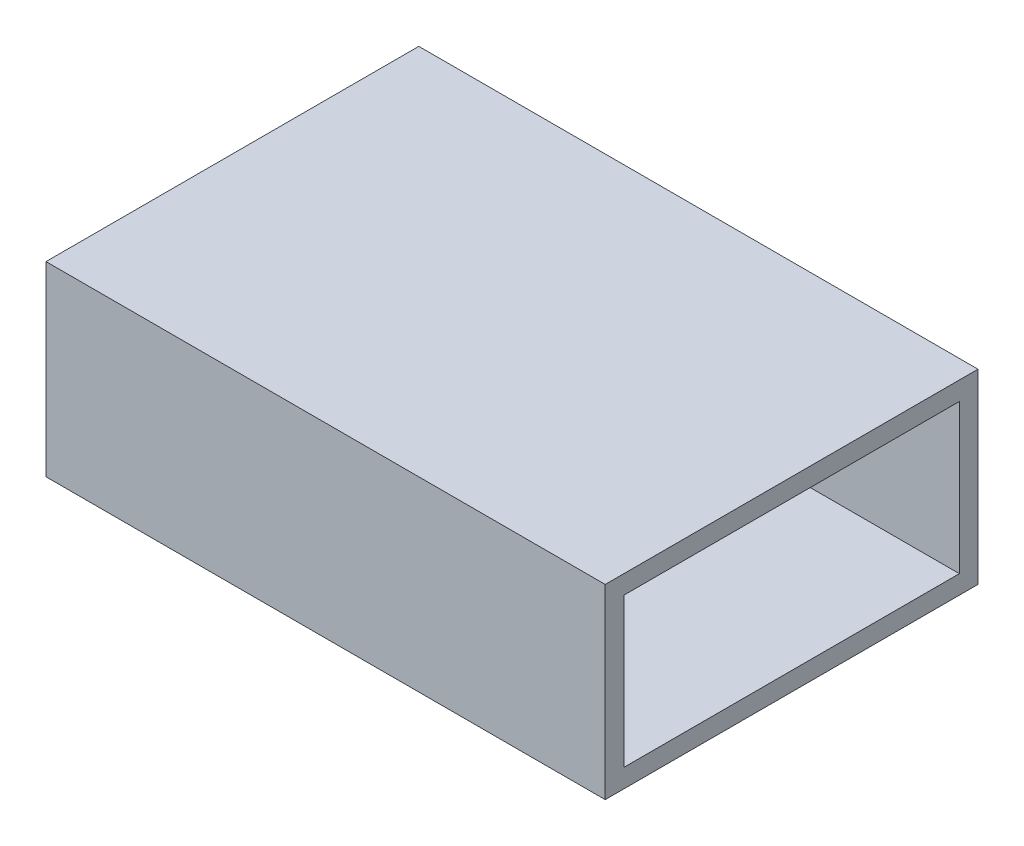
ISO-10303-21;
HEADER;
FILE_DESCRIPTION(('STEP AP214'),'2;1');
FILE_NAME('part.step','',(''),(''),'','','');
FILE_SCHEMA(('AUTOMOTIVE_DESIGN { 1 0 10303 214 1 1 1 1 }'));
ENDSEC;
DATA;
#1=APPLICATION_CONTEXT('core data for automotive mechanical design processes');
#2=APPLICATION_PROTOCOL_DEFINITION('international standard','automotive_design',2000,#1);
#3=PRODUCT_CONTEXT('',#1,'mechanical');
#4=PRODUCT('Part','Part','',(#3));
#5=PRODUCT_RELATED_PRODUCT_CATEGORY('part','',(#4));
#6=PRODUCT_DEFINITION_FORMATION('','',#4);
#7=PRODUCT_DEFINITION_CONTEXT('part definition',#1,'design');
#8=PRODUCT_DEFINITION('design','',#6,#7);
#9=PRODUCT_DEFINITION_SHAPE('','',#8);
#10=(LENGTH_UNIT() NAMED_UNIT(*) SI_UNIT(.MILLI.,.METRE.));
#11=(NAMED_UNIT(*) PLANE_ANGLE_UNIT() SI_UNIT($,.RADIAN.));
#12=(NAMED_UNIT(*) SI_UNIT($,.STERADIAN.) SOLID_ANGLE_UNIT());
#13=UNCERTAINTY_MEASURE_WITH_UNIT(LENGTH_MEASURE(1.E-05),#10,'distance_accuracy_value','');
#14=(GEOMETRIC_REPRESENTATION_CONTEXT(3) GLOBAL_UNCERTAINTY_ASSIGNED_CONTEXT((#13)) GLOBAL_UNIT_ASSIGNED_CONTEXT((#10,
#11,#12)) REPRESENTATION_CONTEXT('',''));
#15=CARTESIAN_POINT('',(0.,0.,0.));
#16=DIRECTION('',(0.,0.,1.));
#17=DIRECTION('',(1.,0.,0.));
#18=AXIS2_PLACEMENT_3D('',#15,#16,#17);
#19=CARTESIAN_POINT('',(38.1,12.6999999999999,25.4));
#20=DIRECTION('',(0.,-1.,0.));
#21=DIRECTION('',(0.,0.,-1.));
#22=AXIS2_PLACEMENT_3D('',#19,#20,#21);
#23=PLANE('',#22);
#24=DIRECTION('',(0.,0.,1.));
#25=VECTOR('',#24,1.);
#26=CARTESIAN_POINT('',(-38.1,12.6999999999999,25.4));
#27=LINE('',#26,#25);
#28=CARTESIAN_POINT('',(-38.1,12.7000000000001,-25.4));
#29=VERTEX_POINT('',#28);
#30=CARTESIAN_POINT('',(-38.1,12.6999999999999,25.4));
#31=VERTEX_POINT('',#30);
#32=EDGE_CURVE('E171',#29,#31,#27,.T.);
#33=ORIENTED_EDGE('',*,*,#32,.T.);
#34=DIRECTION('',(-1.,0.,0.));
#35=VECTOR('',#34,1.);
#36=CARTESIAN_POINT('',(38.1,12.6999999999999,25.4));
#37=LINE('',#36,#35);
#38=CARTESIAN_POINT('',(38.1,12.6999999999999,25.4));
#39=VERTEX_POINT('',#38);
#40=EDGE_CURVE('E12',#39,#31,#37,.T.);
#41=ORIENTED_EDGE('',*,*,#40,.F.);
#42=DIRECTION('',(0.,0.,1.));
#43=VECTOR('',#42,1.);
#44=CARTESIAN_POINT('',(38.1,12.6999999999999,25.4));
#45=LINE('',#44,#43);
#46=CARTESIAN_POINT('',(38.1,12.7000000000001,-25.4));
#47=VERTEX_POINT('',#46);
#48=EDGE_CURVE('E137',#47,#39,#45,.T.);
#49=ORIENTED_EDGE('',*,*,#48,.F.);
#50=DIRECTION('',(-1.,0.,0.));
#51=VECTOR('',#50,1.);
#52=CARTESIAN_POINT('',(38.1,12.7000000000001,-25.4));
#53=LINE('',#52,#51);
#54=EDGE_CURVE('E182',#47,#29,#53,.T.);
#55=ORIENTED_EDGE('',*,*,#54,.T.);
#56=EDGE_LOOP('',(#33,#41,#49,#55));
#57=FACE_BOUND('',#56,.T.);
#58=ADVANCED_FACE('F55',(#57),#23,.F.);
#59=CARTESIAN_POINT('',(38.1,-12.7000000000001,25.3999999999999));
#60=DIRECTION('',(0.,0.,-1.));
#61=DIRECTION('',(0.,1.,0.));
#62=AXIS2_PLACEMENT_3D('',#59,#60,#61);
#63=PLANE('',#62);
#64=DIRECTION('',(0.,-1.,0.));
#65=VECTOR('',#64,1.);
#66=CARTESIAN_POINT('',(-38.1,-12.7000000000001,25.3999999999999));
#67=LINE('',#66,#65);
#68=CARTESIAN_POINT('',(-38.1,-12.7000000000001,25.3999999999999));
#69=VERTEX_POINT('',#68);
#70=EDGE_CURVE('E143',#31,#69,#67,.T.);
#71=ORIENTED_EDGE('',*,*,#70,.T.);
#72=DIRECTION('',(-1.,0.,0.));
#73=VECTOR('',#72,1.);
#74=CARTESIAN_POINT('',(38.1,-12.7000000000001,25.3999999999999));
#75=LINE('',#74,#73);
#76=CARTESIAN_POINT('',(38.1,-12.7000000000001,25.3999999999999));
#77=VERTEX_POINT('',#76);
#78=EDGE_CURVE('E66',#77,#69,#75,.T.);
#79=ORIENTED_EDGE('',*,*,#78,.F.);
#80=DIRECTION('',(0.,-1.,0.));
#81=VECTOR('',#80,1.);
#82=CARTESIAN_POINT('',(38.1,-12.7000000000001,25.3999999999999));
#83=LINE('',#82,#81);
#84=EDGE_CURVE('E131',#39,#77,#83,.T.);
#85=ORIENTED_EDGE('',*,*,#84,.F.);
#86=ORIENTED_EDGE('',*,*,#40,.T.);
#87=EDGE_LOOP('',(#71,#79,#85,#86));
#88=FACE_BOUND('',#87,.T.);
#89=ADVANCED_FACE('F142',(#88),#63,.F.);
#90=CARTESIAN_POINT('',(38.1,-12.7000000000001,25.3999999999999));
#91=DIRECTION('',(0.,1.,0.));
#92=DIRECTION('',(0.,0.,1.));
#93=AXIS2_PLACEMENT_3D('',#90,#91,#92);
#94=PLANE('',#93);
#95=DIRECTION('',(0.,0.,-1.));
#96=VECTOR('',#95,1.);
#97=CARTESIAN_POINT('',(-38.1,-12.7000000000001,25.3999999999999));
#98=LINE('',#97,#96);
#99=CARTESIAN_POINT('',(-38.1,-12.6999999999999,-25.4000000000001));
#100=VERTEX_POINT('',#99);
#101=EDGE_CURVE('E104',#69,#100,#98,.T.);
#102=ORIENTED_EDGE('',*,*,#101,.T.);
#103=DIRECTION('',(-1.,0.,0.));
#104=VECTOR('',#103,1.);
#105=CARTESIAN_POINT('',(38.1,-12.6999999999999,-25.4000000000001));
#106=LINE('',#105,#104);
#107=CARTESIAN_POINT('',(38.1,-12.6999999999999,-25.4000000000001));
#108=VERTEX_POINT('',#107);
#109=EDGE_CURVE('E145',#108,#100,#106,.T.);
#110=ORIENTED_EDGE('',*,*,#109,.F.);
#111=DIRECTION('',(0.,0.,-1.));
#112=VECTOR('',#111,1.);
#113=CARTESIAN_POINT('',(38.1,-12.7000000000001,25.3999999999999));
#114=LINE('',#113,#112);
#115=EDGE_CURVE('E135',#77,#108,#114,.T.);
#116=ORIENTED_EDGE('',*,*,#115,.F.);
#117=ORIENTED_EDGE('',*,*,#78,.T.);
#118=EDGE_LOOP('',(#102,#110,#116,#117));
#119=FACE_BOUND('',#118,.T.);
#120=ADVANCED_FACE('F147',(#119),#94,.F.);
#121=CARTESIAN_POINT('',(38.1,-10.1600000000001,22.86));
#122=DIRECTION('',(0.,0.,-1.));
#123=DIRECTION('',(0.,1.,0.));
#124=AXIS2_PLACEMENT_3D('',#121,#122,#123);
#125=PLANE('',#124);
#126=DIRECTION('',(0.,-1.,0.));
#127=VECTOR('',#126,1.);
#128=CARTESIAN_POINT('',(-38.1,-10.1600000000001,22.86));
#129=LINE('',#128,#127);
#130=CARTESIAN_POINT('',(-38.1,10.1599999999999,22.86));
#131=VERTEX_POINT('',#130);
#132=CARTESIAN_POINT('',(-38.1,-10.1600000000001,22.86));
#133=VERTEX_POINT('',#132);
#134=EDGE_CURVE('E155',#131,#133,#129,.T.);
#135=ORIENTED_EDGE('',*,*,#134,.F.);
#136=DIRECTION('',(-1.,0.,0.));
#137=VECTOR('',#136,1.);
#138=CARTESIAN_POINT('',(38.1,10.1599999999999,22.86));
#139=LINE('',#138,#137);
#140=CARTESIAN_POINT('',(38.1,10.1599999999999,22.86));
#141=VERTEX_POINT('',#140);
#142=EDGE_CURVE('E59',#141,#131,#139,.T.);
#143=ORIENTED_EDGE('',*,*,#142,.F.);
#144=DIRECTION('',(0.,-1.,0.));
#145=VECTOR('',#144,1.);
#146=CARTESIAN_POINT('',(38.1,-10.1600000000001,22.86));
#147=LINE('',#146,#145);
#148=CARTESIAN_POINT('',(38.1,-10.1600000000001,22.86));
#149=VERTEX_POINT('',#148);
#150=EDGE_CURVE('E181',#141,#149,#147,.T.);
#151=ORIENTED_EDGE('',*,*,#150,.T.);
#152=DIRECTION('',(-1.,0.,0.));
#153=VECTOR('',#152,1.);
#154=CARTESIAN_POINT('',(38.1,-10.1600000000001,22.86));
#155=LINE('',#154,#153);
#156=EDGE_CURVE('E151',#149,#133,#155,.T.);
#157=ORIENTED_EDGE('',*,*,#156,.T.);
#158=EDGE_LOOP('',(#135,#143,#151,#157));
#159=FACE_BOUND('',#158,.T.);
#160=ADVANCED_FACE('F57',(#159),#125,.T.);
#161=CARTESIAN_POINT('',(38.1,10.1599999999999,22.86));
#162=DIRECTION('',(0.,-1.,0.));
#163=DIRECTION('',(0.,0.,-1.));
#164=AXIS2_PLACEMENT_3D('',#161,#162,#163);
#165=PLANE('',#164);
#166=DIRECTION('',(0.,0.,1.));
#167=VECTOR('',#166,1.);
#168=CARTESIAN_POINT('',(-38.1,10.1599999999999,22.86));
#169=LINE('',#168,#167);
#170=CARTESIAN_POINT('',(-38.1,10.1600000000001,-22.86));
#171=VERTEX_POINT('',#170);
#172=EDGE_CURVE('E159',#171,#131,#169,.T.);
#173=ORIENTED_EDGE('',*,*,#172,.F.);
#174=DIRECTION('',(-1.,0.,0.));
#175=VECTOR('',#174,1.);
#176=CARTESIAN_POINT('',(38.1,10.1600000000001,-22.86));
#177=LINE('',#176,#175);
#178=CARTESIAN_POINT('',(38.1,10.1600000000001,-22.86));
#179=VERTEX_POINT('',#178);
#180=EDGE_CURVE('E191',#179,#171,#177,.T.);
#181=ORIENTED_EDGE('',*,*,#180,.F.);
#182=DIRECTION('',(0.,0.,1.));
#183=VECTOR('',#182,1.);
#184=CARTESIAN_POINT('',(38.1,10.1599999999999,22.86));
#185=LINE('',#184,#183);
#186=EDGE_CURVE('E202',#179,#141,#185,.T.);
#187=ORIENTED_EDGE('',*,*,#186,.T.);
#188=ORIENTED_EDGE('',*,*,#142,.T.);
#189=EDGE_LOOP('',(#173,#181,#187,#188));
#190=FACE_BOUND('',#189,.T.);
#191=ADVANCED_FACE('F200',(#190),#165,.T.);
#192=CARTESIAN_POINT('',(38.1,-10.1599999999999,-22.86));
#193=DIRECTION('',(0.,0.,1.));
#194=DIRECTION('',(0.,-1.,0.));
#195=AXIS2_PLACEMENT_3D('',#192,#193,#194);
#196=PLANE('',#195);
#197=DIRECTION('',(0.,1.,0.));
#198=VECTOR('',#197,1.);
#199=CARTESIAN_POINT('',(-38.1,-10.1599999999999,-22.86));
#200=LINE('',#199,#198);
#201=CARTESIAN_POINT('',(-38.1,-10.1599999999999,-22.86));
#202=VERTEX_POINT('',#201);
#203=EDGE_CURVE('E163',#202,#171,#200,.T.);
#204=ORIENTED_EDGE('',*,*,#203,.F.);
#205=DIRECTION('',(-1.,0.,0.));
#206=VECTOR('',#205,1.);
#207=CARTESIAN_POINT('',(38.1,-10.1599999999999,-22.86));
#208=LINE('',#207,#206);
#209=CARTESIAN_POINT('',(38.1,-10.1599999999999,-22.86));
#210=VERTEX_POINT('',#209);
#211=EDGE_CURVE('E189',#210,#202,#208,.T.);
#212=ORIENTED_EDGE('',*,*,#211,.F.);
#213=DIRECTION('',(0.,1.,0.));
#214=VECTOR('',#213,1.);
#215=CARTESIAN_POINT('',(38.1,-10.1599999999999,-22.86));
#216=LINE('',#215,#214);
#217=EDGE_CURVE('E209',#210,#179,#216,.T.);
#218=ORIENTED_EDGE('',*,*,#217,.T.);
#219=ORIENTED_EDGE('',*,*,#180,.T.);
#220=EDGE_LOOP('',(#204,#212,#218,#219));
#221=FACE_BOUND('',#220,.T.);
#222=ADVANCED_FACE('F207',(#221),#196,.T.);
#223=CARTESIAN_POINT('',(38.1,-10.1600000000001,22.86));
#224=DIRECTION('',(0.,1.,0.));
#225=DIRECTION('',(0.,0.,1.));
#226=AXIS2_PLACEMENT_3D('',#223,#224,#225);
#227=PLANE('',#226);
#228=DIRECTION('',(0.,0.,-1.));
#229=VECTOR('',#228,1.);
#230=CARTESIAN_POINT('',(-38.1,-10.1600000000001,22.86));
#231=LINE('',#230,#229);
#232=EDGE_CURVE('E167',#133,#202,#231,.T.);
#233=ORIENTED_EDGE('',*,*,#232,.F.);
#234=ORIENTED_EDGE('',*,*,#156,.F.);
#235=DIRECTION('',(0.,0.,-1.));
#236=VECTOR('',#235,1.);
#237=CARTESIAN_POINT('',(38.1,-10.1600000000001,22.86));
#238=LINE('',#237,#236);
#239=EDGE_CURVE('E214',#149,#210,#238,.T.);
#240=ORIENTED_EDGE('',*,*,#239,.T.);
#241=ORIENTED_EDGE('',*,*,#211,.T.);
#242=EDGE_LOOP('',(#233,#234,#240,#241));
#243=FACE_BOUND('',#242,.T.);
#244=ADVANCED_FACE('F217',(#243),#227,.T.);
#245=CARTESIAN_POINT('',(38.1,-12.6999999999999,-25.4000000000001));
#246=DIRECTION('',(0.,0.,1.));
#247=DIRECTION('',(0.,-1.,0.));
#248=AXIS2_PLACEMENT_3D('',#245,#246,#247);
#249=PLANE('',#248);
#250=DIRECTION('',(0.,1.,0.));
#251=VECTOR('',#250,1.);
#252=CARTESIAN_POINT('',(-38.1,-12.6999999999999,-25.4000000000001));
#253=LINE('',#252,#251);
#254=EDGE_CURVE('E110',#100,#29,#253,.T.);
#255=ORIENTED_EDGE('',*,*,#254,.T.);
#256=ORIENTED_EDGE('',*,*,#54,.F.);
#257=DIRECTION('',(0.,1.,0.));
#258=VECTOR('',#257,1.);
#259=CARTESIAN_POINT('',(38.1,-12.6999999999999,-25.4000000000001));
#260=LINE('',#259,#258);
#261=EDGE_CURVE('E75',#108,#47,#260,.T.);
#262=ORIENTED_EDGE('',*,*,#261,.F.);
#263=ORIENTED_EDGE('',*,*,#109,.T.);
#264=EDGE_LOOP('',(#255,#256,#262,#263));
#265=FACE_BOUND('',#264,.T.);
#266=ADVANCED_FACE('F226',(#265),#249,.F.);
#267=CARTESIAN_POINT('',(38.1,0.,0.));
#268=DIRECTION('',(1.,0.,0.));
#269=DIRECTION('',(0.,0.,-1.));
#270=AXIS2_PLACEMENT_3D('',#267,#268,#269);
#271=PLANE('',#270);
#272=ORIENTED_EDGE('',*,*,#150,.F.);
#273=ORIENTED_EDGE('',*,*,#186,.F.);
#274=ORIENTED_EDGE('',*,*,#217,.F.);
#275=ORIENTED_EDGE('',*,*,#239,.F.);
#276=EDGE_LOOP('',(#272,#273,#274,#275));
#277=FACE_BOUND('',#276,.T.);
#278=ORIENTED_EDGE('',*,*,#48,.T.);
#279=ORIENTED_EDGE('',*,*,#84,.T.);
#280=ORIENTED_EDGE('',*,*,#115,.T.);
#281=ORIENTED_EDGE('',*,*,#261,.T.);
#282=EDGE_LOOP('',(#278,#279,#280,#281));
#283=FACE_BOUND('',#282,.T.);
#284=ADVANCED_FACE('F133',(#277,#283),#271,.T.);
#285=CARTESIAN_POINT('',(-38.1,0.,0.));
#286=DIRECTION('',(1.,0.,0.));
#287=DIRECTION('',(0.,0.,-1.));
#288=AXIS2_PLACEMENT_3D('',#285,#286,#287);
#289=PLANE('',#288);
#290=ORIENTED_EDGE('',*,*,#134,.T.);
#291=ORIENTED_EDGE('',*,*,#232,.T.);
#292=ORIENTED_EDGE('',*,*,#203,.T.);
#293=ORIENTED_EDGE('',*,*,#172,.T.);
#294=EDGE_LOOP('',(#290,#291,#292,#293));
#295=FACE_BOUND('',#294,.T.);
#296=ORIENTED_EDGE('',*,*,#32,.F.);
#297=ORIENTED_EDGE('',*,*,#254,.F.);
#298=ORIENTED_EDGE('',*,*,#101,.F.);
#299=ORIENTED_EDGE('',*,*,#70,.F.);
#300=EDGE_LOOP('',(#296,#297,#298,#299));
#301=FACE_BOUND('',#300,.T.);
#302=ADVANCED_FACE('F205',(#295,#301),#289,.F.);
#303=CLOSED_SHELL('',(#58,#89,#120,#160,#191,#222,#244,#266,#284,#302));
#304=MANIFOLD_SOLID_BREP('B2',#303);
#305=ADVANCED_BREP_SHAPE_REPRESENTATION('',(#18,#304),#14);
#306=SHAPE_DEFINITION_REPRESENTATION(#9,#305);
ENDSEC;
END-ISO-10303-21;
